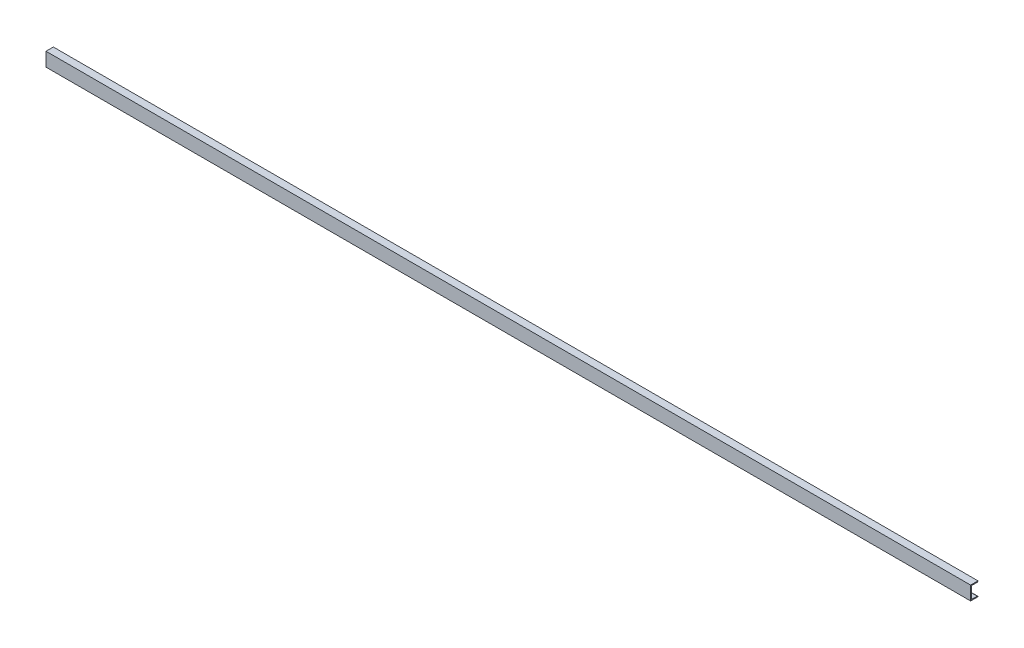
ISO-10303-21;
HEADER;
FILE_DESCRIPTION(('STEP AP214'),'2;1');
FILE_NAME('part.step','',(''),(''),'','','');
FILE_SCHEMA(('AUTOMOTIVE_DESIGN { 1 0 10303 214 1 1 1 1 }'));
ENDSEC;
DATA;
#1=APPLICATION_CONTEXT('core data for automotive mechanical design processes');
#2=APPLICATION_PROTOCOL_DEFINITION('international standard','automotive_design',2000,#1);
#3=PRODUCT_CONTEXT('',#1,'mechanical');
#4=PRODUCT('Part','Part','',(#3));
#5=PRODUCT_RELATED_PRODUCT_CATEGORY('part','',(#4));
#6=PRODUCT_DEFINITION_FORMATION('','',#4);
#7=PRODUCT_DEFINITION_CONTEXT('part definition',#1,'design');
#8=PRODUCT_DEFINITION('design','',#6,#7);
#9=PRODUCT_DEFINITION_SHAPE('','',#8);
#10=(LENGTH_UNIT() NAMED_UNIT(*) SI_UNIT(.MILLI.,.METRE.));
#11=(NAMED_UNIT(*) PLANE_ANGLE_UNIT() SI_UNIT($,.RADIAN.));
#12=(NAMED_UNIT(*) SI_UNIT($,.STERADIAN.) SOLID_ANGLE_UNIT());
#13=UNCERTAINTY_MEASURE_WITH_UNIT(LENGTH_MEASURE(1.E-05),#10,'distance_accuracy_value','');
#14=(GEOMETRIC_REPRESENTATION_CONTEXT(3) GLOBAL_UNCERTAINTY_ASSIGNED_CONTEXT((#13)) GLOBAL_UNIT_ASSIGNED_CONTEXT((#10,
#11,#12)) REPRESENTATION_CONTEXT('',''));
#15=CARTESIAN_POINT('',(0.,0.,0.));
#16=DIRECTION('',(0.,0.,1.));
#17=DIRECTION('',(1.,0.,0.));
#18=AXIS2_PLACEMENT_3D('',#15,#16,#17);
#19=CARTESIAN_POINT('',(5030.,75.,0.));
#20=DIRECTION('',(0.,0.,-1.));
#21=DIRECTION('',(-1.,0.,0.));
#22=AXIS2_PLACEMENT_3D('',#19,#20,#21);
#23=PLANE('',#22);
#24=DIRECTION('',(0.,-1.,0.));
#25=VECTOR('',#24,1.);
#26=CARTESIAN_POINT('',(0.,75.,0.));
#27=LINE('',#26,#25);
#28=CARTESIAN_POINT('',(0.,75.,0.));
#29=VERTEX_POINT('',#28);
#30=CARTESIAN_POINT('',(0.,0.,0.));
#31=VERTEX_POINT('',#30);
#32=EDGE_CURVE('E129',#29,#31,#27,.T.);
#33=ORIENTED_EDGE('',*,*,#32,.T.);
#34=DIRECTION('',(-1.,0.,0.));
#35=VECTOR('',#34,1.);
#36=CARTESIAN_POINT('',(5030.,0.,0.));
#37=LINE('',#36,#35);
#38=CARTESIAN_POINT('',(5030.,0.,0.));
#39=VERTEX_POINT('',#38);
#40=EDGE_CURVE('E11',#39,#31,#37,.T.);
#41=ORIENTED_EDGE('',*,*,#40,.F.);
#42=DIRECTION('',(0.,-1.,0.));
#43=VECTOR('',#42,1.);
#44=CARTESIAN_POINT('',(5030.,75.,0.));
#45=LINE('',#44,#43);
#46=CARTESIAN_POINT('',(5030.,75.,0.));
#47=VERTEX_POINT('',#46);
#48=EDGE_CURVE('E143',#47,#39,#45,.T.);
#49=ORIENTED_EDGE('',*,*,#48,.F.);
#50=DIRECTION('',(-1.,0.,0.));
#51=VECTOR('',#50,1.);
#52=CARTESIAN_POINT('',(5030.,75.,0.));
#53=LINE('',#52,#51);
#54=EDGE_CURVE('E125',#47,#29,#53,.T.);
#55=ORIENTED_EDGE('',*,*,#54,.T.);
#56=EDGE_LOOP('',(#33,#41,#49,#55));
#57=FACE_BOUND('',#56,.T.);
#58=ADVANCED_FACE('F33',(#57),#23,.F.);
#59=CARTESIAN_POINT('',(5030.,0.,0.));
#60=DIRECTION('',(0.,1.,0.));
#61=DIRECTION('',(0.,0.,1.));
#62=AXIS2_PLACEMENT_3D('',#59,#60,#61);
#63=PLANE('',#62);
#64=DIRECTION('',(0.,0.,-1.));
#65=VECTOR('',#64,1.);
#66=CARTESIAN_POINT('',(0.,0.,0.));
#67=LINE('',#66,#65);
#68=CARTESIAN_POINT('',(0.,0.,-40.));
#69=VERTEX_POINT('',#68);
#70=EDGE_CURVE('E132',#31,#69,#67,.T.);
#71=ORIENTED_EDGE('',*,*,#70,.T.);
#72=DIRECTION('',(-1.,0.,0.));
#73=VECTOR('',#72,1.);
#74=CARTESIAN_POINT('',(5030.,0.,-40.));
#75=LINE('',#74,#73);
#76=CARTESIAN_POINT('',(5030.,0.,-40.));
#77=VERTEX_POINT('',#76);
#78=EDGE_CURVE('E41',#77,#69,#75,.T.);
#79=ORIENTED_EDGE('',*,*,#78,.F.);
#80=DIRECTION('',(0.,0.,-1.));
#81=VECTOR('',#80,1.);
#82=CARTESIAN_POINT('',(5030.,0.,0.));
#83=LINE('',#82,#81);
#84=EDGE_CURVE('E92',#39,#77,#83,.T.);
#85=ORIENTED_EDGE('',*,*,#84,.F.);
#86=ORIENTED_EDGE('',*,*,#40,.T.);
#87=EDGE_LOOP('',(#71,#79,#85,#86));
#88=FACE_BOUND('',#87,.T.);
#89=ADVANCED_FACE('F178',(#88),#63,.F.);
#90=CARTESIAN_POINT('',(5030.,0.,-35.));
#91=DIRECTION('',(-1.,0.,0.));
#92=DIRECTION('',(0.,0.,1.));
#93=AXIS2_PLACEMENT_3D('',#90,#91,#92);
#94=CYLINDRICAL_SURFACE('',#93,5.);
#95=CARTESIAN_POINT('',(0.,0.,-35.));
#96=DIRECTION('',(1.,0.,0.));
#97=DIRECTION('',(0.,0.,-1.));
#98=AXIS2_PLACEMENT_3D('',#95,#96,#97);
#99=CIRCLE('',#98,5.);
#100=CARTESIAN_POINT('',(0.,5.,-35.));
#101=VERTEX_POINT('',#100);
#102=EDGE_CURVE('E134',#69,#101,#99,.T.);
#103=ORIENTED_EDGE('',*,*,#102,.T.);
#104=DIRECTION('',(-1.,0.,0.));
#105=VECTOR('',#104,1.);
#106=CARTESIAN_POINT('',(5030.,5.,-35.));
#107=LINE('',#106,#105);
#108=CARTESIAN_POINT('',(5030.,5.,-35.));
#109=VERTEX_POINT('',#108);
#110=EDGE_CURVE('E150',#109,#101,#107,.T.);
#111=ORIENTED_EDGE('',*,*,#110,.F.);
#112=CARTESIAN_POINT('',(5030.,0.,-35.));
#113=DIRECTION('',(1.,0.,0.));
#114=DIRECTION('',(0.,0.,-1.));
#115=AXIS2_PLACEMENT_3D('',#112,#113,#114);
#116=CIRCLE('',#115,5.);
#117=EDGE_CURVE('E158',#77,#109,#116,.T.);
#118=ORIENTED_EDGE('',*,*,#117,.F.);
#119=ORIENTED_EDGE('',*,*,#78,.T.);
#120=EDGE_LOOP('',(#103,#111,#118,#119));
#121=FACE_BOUND('',#120,.T.);
#122=ADVANCED_FACE('F156',(#121),#94,.T.);
#123=CARTESIAN_POINT('',(5030.,5.,-35.));
#124=DIRECTION('',(0.,-1.,0.));
#125=DIRECTION('',(0.,0.,-1.));
#126=AXIS2_PLACEMENT_3D('',#123,#124,#125);
#127=PLANE('',#126);
#128=DIRECTION('',(0.,0.,1.));
#129=VECTOR('',#128,1.);
#130=CARTESIAN_POINT('',(0.,5.,-35.));
#131=LINE('',#130,#129);
#132=CARTESIAN_POINT('',(0.,5.,-5.00000000000001));
#133=VERTEX_POINT('',#132);
#134=EDGE_CURVE('E136',#101,#133,#131,.T.);
#135=ORIENTED_EDGE('',*,*,#134,.T.);
#136=DIRECTION('',(-1.,0.,0.));
#137=VECTOR('',#136,1.);
#138=CARTESIAN_POINT('',(5030.,5.,-5.00000000000001));
#139=LINE('',#138,#137);
#140=CARTESIAN_POINT('',(5030.,5.,-5.00000000000001));
#141=VERTEX_POINT('',#140);
#142=EDGE_CURVE('E147',#141,#133,#139,.T.);
#143=ORIENTED_EDGE('',*,*,#142,.F.);
#144=DIRECTION('',(0.,0.,1.));
#145=VECTOR('',#144,1.);
#146=CARTESIAN_POINT('',(5030.,5.,-35.));
#147=LINE('',#146,#145);
#148=EDGE_CURVE('E170',#109,#141,#147,.T.);
#149=ORIENTED_EDGE('',*,*,#148,.F.);
#150=ORIENTED_EDGE('',*,*,#110,.T.);
#151=EDGE_LOOP('',(#135,#143,#149,#150));
#152=FACE_BOUND('',#151,.T.);
#153=ADVANCED_FACE('F166',(#152),#127,.F.);
#154=CARTESIAN_POINT('',(5030.,5.,-5.00000000000001));
#155=DIRECTION('',(0.,0.,1.));
#156=DIRECTION('',(0.,-1.,0.));
#157=AXIS2_PLACEMENT_3D('',#154,#155,#156);
#158=PLANE('',#157);
#159=DIRECTION('',(0.,1.,0.));
#160=VECTOR('',#159,1.);
#161=CARTESIAN_POINT('',(0.,5.,-5.00000000000001));
#162=LINE('',#161,#160);
#163=CARTESIAN_POINT('',(0.,70.,-5.00000000000001));
#164=VERTEX_POINT('',#163);
#165=EDGE_CURVE('E138',#133,#164,#162,.T.);
#166=ORIENTED_EDGE('',*,*,#165,.T.);
#167=DIRECTION('',(-1.,0.,0.));
#168=VECTOR('',#167,1.);
#169=CARTESIAN_POINT('',(5030.,70.,-5.00000000000001));
#170=LINE('',#169,#168);
#171=CARTESIAN_POINT('',(5030.,70.,-5.00000000000001));
#172=VERTEX_POINT('',#171);
#173=EDGE_CURVE('E120',#172,#164,#170,.T.);
#174=ORIENTED_EDGE('',*,*,#173,.F.);
#175=DIRECTION('',(0.,1.,0.));
#176=VECTOR('',#175,1.);
#177=CARTESIAN_POINT('',(5030.,5.,-5.00000000000001));
#178=LINE('',#177,#176);
#179=EDGE_CURVE('E111',#141,#172,#178,.T.);
#180=ORIENTED_EDGE('',*,*,#179,.F.);
#181=ORIENTED_EDGE('',*,*,#142,.T.);
#182=EDGE_LOOP('',(#166,#174,#180,#181));
#183=FACE_BOUND('',#182,.T.);
#184=ADVANCED_FACE('F169',(#183),#158,.F.);
#185=CARTESIAN_POINT('',(5030.,70.,-5.00000000000001));
#186=DIRECTION('',(0.,1.,0.));
#187=DIRECTION('',(0.,0.,1.));
#188=AXIS2_PLACEMENT_3D('',#185,#186,#187);
#189=PLANE('',#188);
#190=DIRECTION('',(0.,0.,-1.));
#191=VECTOR('',#190,1.);
#192=CARTESIAN_POINT('',(0.,70.,-5.00000000000001));
#193=LINE('',#192,#191);
#194=CARTESIAN_POINT('',(0.,70.,-35.));
#195=VERTEX_POINT('',#194);
#196=EDGE_CURVE('E119',#164,#195,#193,.T.);
#197=ORIENTED_EDGE('',*,*,#196,.T.);
#198=DIRECTION('',(-1.,0.,0.));
#199=VECTOR('',#198,1.);
#200=CARTESIAN_POINT('',(5030.,70.,-35.));
#201=LINE('',#200,#199);
#202=CARTESIAN_POINT('',(5030.,70.,-35.));
#203=VERTEX_POINT('',#202);
#204=EDGE_CURVE('E116',#203,#195,#201,.T.);
#205=ORIENTED_EDGE('',*,*,#204,.F.);
#206=DIRECTION('',(0.,0.,-1.));
#207=VECTOR('',#206,1.);
#208=CARTESIAN_POINT('',(5030.,70.,-5.00000000000001));
#209=LINE('',#208,#207);
#210=EDGE_CURVE('E105',#172,#203,#209,.T.);
#211=ORIENTED_EDGE('',*,*,#210,.F.);
#212=ORIENTED_EDGE('',*,*,#173,.T.);
#213=EDGE_LOOP('',(#197,#205,#211,#212));
#214=FACE_BOUND('',#213,.T.);
#215=ADVANCED_FACE('F117',(#214),#189,.F.);
#216=CARTESIAN_POINT('',(5030.,75.,-35.));
#217=DIRECTION('',(-1.,0.,0.));
#218=DIRECTION('',(0.,0.,1.));
#219=AXIS2_PLACEMENT_3D('',#216,#217,#218);
#220=CYLINDRICAL_SURFACE('',#219,5.);
#221=CARTESIAN_POINT('',(0.,75.,-35.));
#222=DIRECTION('',(1.,0.,0.));
#223=DIRECTION('',(0.,0.,-1.));
#224=AXIS2_PLACEMENT_3D('',#221,#222,#223);
#225=CIRCLE('',#224,5.);
#226=CARTESIAN_POINT('',(0.,75.,-40.));
#227=VERTEX_POINT('',#226);
#228=EDGE_CURVE('E78',#195,#227,#225,.T.);
#229=ORIENTED_EDGE('',*,*,#228,.T.);
#230=DIRECTION('',(-1.,0.,0.));
#231=VECTOR('',#230,1.);
#232=CARTESIAN_POINT('',(5030.,75.,-40.));
#233=LINE('',#232,#231);
#234=CARTESIAN_POINT('',(5030.,75.,-40.));
#235=VERTEX_POINT('',#234);
#236=EDGE_CURVE('E121',#235,#227,#233,.T.);
#237=ORIENTED_EDGE('',*,*,#236,.F.);
#238=CARTESIAN_POINT('',(5030.,75.,-35.));
#239=DIRECTION('',(1.,0.,0.));
#240=DIRECTION('',(0.,0.,-1.));
#241=AXIS2_PLACEMENT_3D('',#238,#239,#240);
#242=CIRCLE('',#241,5.);
#243=EDGE_CURVE('E109',#203,#235,#242,.T.);
#244=ORIENTED_EDGE('',*,*,#243,.F.);
#245=ORIENTED_EDGE('',*,*,#204,.T.);
#246=EDGE_LOOP('',(#229,#237,#244,#245));
#247=FACE_BOUND('',#246,.T.);
#248=ADVANCED_FACE('F123',(#247),#220,.T.);
#249=CARTESIAN_POINT('',(5030.,75.,-40.));
#250=DIRECTION('',(0.,-1.,0.));
#251=DIRECTION('',(0.,0.,-1.));
#252=AXIS2_PLACEMENT_3D('',#249,#250,#251);
#253=PLANE('',#252);
#254=DIRECTION('',(0.,0.,1.));
#255=VECTOR('',#254,1.);
#256=CARTESIAN_POINT('',(0.,75.,-40.));
#257=LINE('',#256,#255);
#258=EDGE_CURVE('E84',#227,#29,#257,.T.);
#259=ORIENTED_EDGE('',*,*,#258,.T.);
#260=ORIENTED_EDGE('',*,*,#54,.F.);
#261=DIRECTION('',(0.,0.,1.));
#262=VECTOR('',#261,1.);
#263=CARTESIAN_POINT('',(5030.,75.,-40.));
#264=LINE('',#263,#262);
#265=EDGE_CURVE('E49',#235,#47,#264,.T.);
#266=ORIENTED_EDGE('',*,*,#265,.F.);
#267=ORIENTED_EDGE('',*,*,#236,.T.);
#268=EDGE_LOOP('',(#259,#260,#266,#267));
#269=FACE_BOUND('',#268,.T.);
#270=ADVANCED_FACE('F194',(#269),#253,.F.);
#271=CARTESIAN_POINT('',(5030.,0.,-35.));
#272=DIRECTION('',(1.,0.,0.));
#273=DIRECTION('',(0.,0.,-1.));
#274=AXIS2_PLACEMENT_3D('',#271,#272,#273);
#275=PLANE('',#274);
#276=ORIENTED_EDGE('',*,*,#48,.T.);
#277=ORIENTED_EDGE('',*,*,#84,.T.);
#278=ORIENTED_EDGE('',*,*,#117,.T.);
#279=ORIENTED_EDGE('',*,*,#148,.T.);
#280=ORIENTED_EDGE('',*,*,#179,.T.);
#281=ORIENTED_EDGE('',*,*,#210,.T.);
#282=ORIENTED_EDGE('',*,*,#243,.T.);
#283=ORIENTED_EDGE('',*,*,#265,.T.);
#284=EDGE_LOOP('',(#276,#277,#278,#279,#280,#281,#282,#283));
#285=FACE_BOUND('',#284,.T.);
#286=ADVANCED_FACE('F107',(#285),#275,.T.);
#287=CARTESIAN_POINT('',(0.,0.,-35.));
#288=DIRECTION('',(1.,0.,0.));
#289=DIRECTION('',(0.,0.,-1.));
#290=AXIS2_PLACEMENT_3D('',#287,#288,#289);
#291=PLANE('',#290);
#292=ORIENTED_EDGE('',*,*,#32,.F.);
#293=ORIENTED_EDGE('',*,*,#258,.F.);
#294=ORIENTED_EDGE('',*,*,#228,.F.);
#295=ORIENTED_EDGE('',*,*,#196,.F.);
#296=ORIENTED_EDGE('',*,*,#165,.F.);
#297=ORIENTED_EDGE('',*,*,#134,.F.);
#298=ORIENTED_EDGE('',*,*,#102,.F.);
#299=ORIENTED_EDGE('',*,*,#70,.F.);
#300=EDGE_LOOP('',(#292,#293,#294,#295,#296,#297,#298,#299));
#301=FACE_BOUND('',#300,.T.);
#302=ADVANCED_FACE('F162',(#301),#291,.F.);
#303=CLOSED_SHELL('',(#58,#89,#122,#153,#184,#215,#248,#270,#286,#302));
#304=MANIFOLD_SOLID_BREP('B2',#303);
#305=ADVANCED_BREP_SHAPE_REPRESENTATION('',(#18,#304),#14);
#306=SHAPE_DEFINITION_REPRESENTATION(#9,#305);
ENDSEC;
END-ISO-10303-21;
